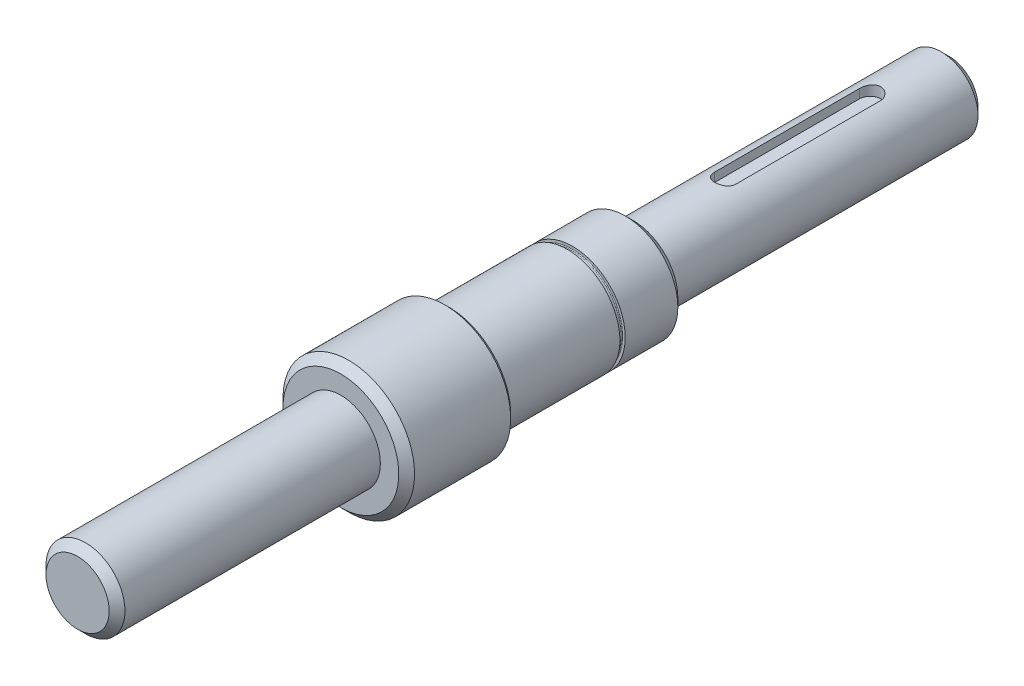
ISO-10303-21;
HEADER;
FILE_DESCRIPTION(('STEP AP214'),'2;1');
FILE_NAME('part.step','',(''),(''),'','','');
FILE_SCHEMA(('AUTOMOTIVE_DESIGN { 1 0 10303 214 1 1 1 1 }'));
ENDSEC;
DATA;
#1=APPLICATION_CONTEXT('core data for automotive mechanical design processes');
#2=APPLICATION_PROTOCOL_DEFINITION('international standard','automotive_design',2000,#1);
#3=PRODUCT_CONTEXT('',#1,'mechanical');
#4=PRODUCT('Part','Part','',(#3));
#5=PRODUCT_RELATED_PRODUCT_CATEGORY('part','',(#4));
#6=PRODUCT_DEFINITION_FORMATION('','',#4);
#7=PRODUCT_DEFINITION_CONTEXT('part definition',#1,'design');
#8=PRODUCT_DEFINITION('design','',#6,#7);
#9=PRODUCT_DEFINITION_SHAPE('','',#8);
#10=(LENGTH_UNIT() NAMED_UNIT(*) SI_UNIT(.MILLI.,.METRE.));
#11=(NAMED_UNIT(*) PLANE_ANGLE_UNIT() SI_UNIT($,.RADIAN.));
#12=(NAMED_UNIT(*) SI_UNIT($,.STERADIAN.) SOLID_ANGLE_UNIT());
#13=UNCERTAINTY_MEASURE_WITH_UNIT(LENGTH_MEASURE(1.E-05),#10,'distance_accuracy_value','');
#14=(GEOMETRIC_REPRESENTATION_CONTEXT(3) GLOBAL_UNCERTAINTY_ASSIGNED_CONTEXT((#13)) GLOBAL_UNIT_ASSIGNED_CONTEXT((#10,
#11,#12)) REPRESENTATION_CONTEXT('',''));
#15=CARTESIAN_POINT('',(0.,0.,0.));
#16=DIRECTION('',(0.,0.,1.));
#17=DIRECTION('',(1.,0.,0.));
#18=AXIS2_PLACEMENT_3D('',#15,#16,#17);
#19=CARTESIAN_POINT('',(0.,0.,0.));
#20=DIRECTION('',(0.,0.,1.));
#21=DIRECTION('',(1.,0.,0.));
#22=AXIS2_PLACEMENT_3D('',#19,#20,#21);
#23=CYLINDRICAL_SURFACE('',#22,20.);
#24=CARTESIAN_POINT('',(0.,0.,-186.));
#25=DIRECTION('',(0.,0.,-1.));
#26=DIRECTION('',(-1.,0.,0.));
#27=AXIS2_PLACEMENT_3D('',#24,#25,#26);
#28=CIRCLE('',#27,20.);
#29=CARTESIAN_POINT('',(-20.,0.,-186.));
#30=VERTEX_POINT('',#29);
#31=EDGE_CURVE('E124',#30,#30,#28,.T.);
#32=ORIENTED_EDGE('',*,*,#31,.F.);
#33=EDGE_LOOP('',(#32));
#34=FACE_BOUND('',#33,.T.);
#35=CARTESIAN_POINT('',(0.,0.,-141.));
#36=DIRECTION('',(0.,0.,-1.));
#37=DIRECTION('',(-1.,0.,0.));
#38=AXIS2_PLACEMENT_3D('',#35,#36,#37);
#39=CIRCLE('',#38,20.);
#40=CARTESIAN_POINT('',(-20.,0.,-141.));
#41=VERTEX_POINT('',#40);
#42=EDGE_CURVE('E111',#41,#41,#39,.T.);
#43=ORIENTED_EDGE('',*,*,#42,.T.);
#44=EDGE_LOOP('',(#43));
#45=FACE_BOUND('',#44,.T.);
#46=ADVANCED_FACE('F47',(#34,#45),#23,.T.);
#47=CARTESIAN_POINT('',(0.,0.,-186.));
#48=DIRECTION('',(0.,0.,-1.));
#49=DIRECTION('',(-1.,0.,0.));
#50=AXIS2_PLACEMENT_3D('',#47,#48,#49);
#51=PLANE('',#50);
#52=CARTESIAN_POINT('',(0.,0.,-186.));
#53=DIRECTION('',(0.,0.,-1.));
#54=DIRECTION('',(-1.,0.,0.));
#55=AXIS2_PLACEMENT_3D('',#52,#53,#54);
#56=CIRCLE('',#55,19.05);
#57=CARTESIAN_POINT('',(-19.05,0.,-186.));
#58=VERTEX_POINT('',#57);
#59=EDGE_CURVE('E167',#58,#58,#56,.F.);
#60=ORIENTED_EDGE('',*,*,#59,.T.);
#61=EDGE_LOOP('',(#60));
#62=FACE_BOUND('',#61,.T.);
#63=ORIENTED_EDGE('',*,*,#31,.T.);
#64=EDGE_LOOP('',(#63));
#65=FACE_BOUND('',#64,.T.);
#66=ADVANCED_FACE('F235',(#62,#65),#51,.T.);
#67=CARTESIAN_POINT('',(0.,0.,-188.));
#68=DIRECTION('',(0.,0.,-1.));
#69=DIRECTION('',(-1.,0.,0.));
#70=AXIS2_PLACEMENT_3D('',#67,#68,#69);
#71=PLANE('',#70);
#72=CARTESIAN_POINT('',(0.,0.,-188.));
#73=DIRECTION('',(0.,0.,-1.));
#74=DIRECTION('',(-1.,0.,0.));
#75=AXIS2_PLACEMENT_3D('',#72,#73,#74);
#76=CIRCLE('',#75,19.05);
#77=CARTESIAN_POINT('',(-19.05,0.,-188.));
#78=VERTEX_POINT('',#77);
#79=EDGE_CURVE('E166',#78,#78,#76,.T.);
#80=ORIENTED_EDGE('',*,*,#79,.T.);
#81=EDGE_LOOP('',(#80));
#82=FACE_BOUND('',#81,.T.);
#83=CARTESIAN_POINT('',(0.,0.,-188.));
#84=DIRECTION('',(0.,0.,-1.));
#85=DIRECTION('',(-1.,0.,0.));
#86=AXIS2_PLACEMENT_3D('',#83,#84,#85);
#87=CIRCLE('',#86,20.);
#88=CARTESIAN_POINT('',(-20.,0.,-188.));
#89=VERTEX_POINT('',#88);
#90=EDGE_CURVE('E121',#89,#89,#87,.T.);
#91=ORIENTED_EDGE('',*,*,#90,.F.);
#92=EDGE_LOOP('',(#91));
#93=FACE_BOUND('',#92,.T.);
#94=ADVANCED_FACE('F238',(#82,#93),#71,.F.);
#95=CARTESIAN_POINT('',(0.,0.,-186.));
#96=DIRECTION('',(0.,0.,-1.));
#97=DIRECTION('',(-1.,0.,0.));
#98=AXIS2_PLACEMENT_3D('',#95,#96,#97);
#99=CYLINDRICAL_SURFACE('',#98,18.75);
#100=CARTESIAN_POINT('',(0.,0.,-186.3));
#101=DIRECTION('',(0.,0.,-1.));
#102=DIRECTION('',(-1.,0.,0.));
#103=AXIS2_PLACEMENT_3D('',#100,#101,#102);
#104=CIRCLE('',#103,18.75);
#105=CARTESIAN_POINT('',(-18.75,0.,-186.3));
#106=VERTEX_POINT('',#105);
#107=EDGE_CURVE('E164',#106,#106,#104,.T.);
#108=ORIENTED_EDGE('',*,*,#107,.T.);
#109=EDGE_LOOP('',(#108));
#110=FACE_BOUND('',#109,.T.);
#111=CARTESIAN_POINT('',(0.,0.,-187.7));
#112=DIRECTION('',(0.,0.,-1.));
#113=DIRECTION('',(-1.,0.,0.));
#114=AXIS2_PLACEMENT_3D('',#111,#112,#113);
#115=CIRCLE('',#114,18.75);
#116=CARTESIAN_POINT('',(-18.75,0.,-187.7));
#117=VERTEX_POINT('',#116);
#118=EDGE_CURVE('E158',#117,#117,#115,.F.);
#119=ORIENTED_EDGE('',*,*,#118,.T.);
#120=EDGE_LOOP('',(#119));
#121=FACE_BOUND('',#120,.T.);
#122=ADVANCED_FACE('F205',(#110,#121),#99,.T.);
#123=CARTESIAN_POINT('',(0.,0.,-301.));
#124=DIRECTION('',(0.,0.,-1.));
#125=DIRECTION('',(-1.,0.,0.));
#126=AXIS2_PLACEMENT_3D('',#123,#124,#125);
#127=CONICAL_SURFACE('',#126,5.09999999999999,1.02974425867665);
#128=CARTESIAN_POINT('',(0.,0.,-297.935610842959));
#129=VERTEX_POINT('',#128);
#130=VERTEX_LOOP('',#129);
#131=FACE_BOUND('',#130,.T.);
#132=CARTESIAN_POINT('',(0.,0.,-301.));
#133=DIRECTION('',(0.,0.,-1.));
#134=DIRECTION('',(-1.,0.,0.));
#135=AXIS2_PLACEMENT_3D('',#132,#133,#134);
#136=CIRCLE('',#135,5.09999999999999);
#137=CARTESIAN_POINT('',(-5.09999999999999,0.,-301.));
#138=VERTEX_POINT('',#137);
#139=EDGE_CURVE('E134',#138,#138,#136,.T.);
#140=ORIENTED_EDGE('',*,*,#139,.T.);
#141=EDGE_LOOP('',(#140));
#142=FACE_BOUND('',#141,.T.);
#143=ADVANCED_FACE('F387',(#131,#142),#127,.F.);
#144=CARTESIAN_POINT('',(0.,0.,-331.));
#145=DIRECTION('',(0.,0.,-1.));
#146=DIRECTION('',(-1.,0.,0.));
#147=AXIS2_PLACEMENT_3D('',#144,#145,#146);
#148=CYLINDRICAL_SURFACE('',#147,5.09999999999999);
#149=ORIENTED_EDGE('',*,*,#139,.F.);
#150=EDGE_LOOP('',(#149));
#151=FACE_BOUND('',#150,.T.);
#152=CARTESIAN_POINT('',(0.,0.,-331.));
#153=DIRECTION('',(0.,0.,-1.));
#154=DIRECTION('',(-1.,0.,0.));
#155=AXIS2_PLACEMENT_3D('',#152,#153,#154);
#156=CIRCLE('',#155,5.1);
#157=CARTESIAN_POINT('',(-5.1,0.,-331.));
#158=VERTEX_POINT('',#157);
#159=EDGE_CURVE('E127',#158,#158,#156,.T.);
#160=ORIENTED_EDGE('',*,*,#159,.T.);
#161=EDGE_LOOP('',(#160));
#162=FACE_BOUND('',#161,.T.);
#163=ADVANCED_FACE('F386',(#151,#162),#148,.F.);
#164=CARTESIAN_POINT('',(0.,14.,-331.));
#165=DIRECTION('',(0.,0.,1.));
#166=DIRECTION('',(1.,0.,0.));
#167=AXIS2_PLACEMENT_3D('',#164,#165,#166);
#168=PLANE('',#167);
#169=ORIENTED_EDGE('',*,*,#159,.F.);
#170=EDGE_LOOP('',(#169));
#171=FACE_BOUND('',#170,.T.);
#172=CARTESIAN_POINT('',(0.,0.,-331.));
#173=DIRECTION('',(0.,0.,1.));
#174=DIRECTION('',(1.,0.,0.));
#175=AXIS2_PLACEMENT_3D('',#172,#173,#174);
#176=CIRCLE('',#175,11.0000000000001);
#177=CARTESIAN_POINT('',(11.0000000000001,0.,-331.));
#178=VERTEX_POINT('',#177);
#179=EDGE_CURVE('E160',#178,#178,#176,.F.);
#180=ORIENTED_EDGE('',*,*,#179,.T.);
#181=EDGE_LOOP('',(#180));
#182=FACE_BOUND('',#181,.T.);
#183=ADVANCED_FACE('F266',(#171,#182),#168,.F.);
#184=CARTESIAN_POINT('',(0.,0.,-328.));
#185=DIRECTION('',(0.,0.,1.));
#186=DIRECTION('',(1.,0.,0.));
#187=AXIS2_PLACEMENT_3D('',#184,#185,#186);
#188=CONICAL_SURFACE('',#187,14.,0.785398163397451);
#189=ORIENTED_EDGE('',*,*,#179,.F.);
#190=EDGE_LOOP('',(#189));
#191=FACE_BOUND('',#190,.T.);
#192=CARTESIAN_POINT('',(0.,0.,-328.));
#193=DIRECTION('',(0.,0.,1.));
#194=DIRECTION('',(1.,0.,0.));
#195=AXIS2_PLACEMENT_3D('',#192,#193,#194);
#196=CIRCLE('',#195,14.);
#197=CARTESIAN_POINT('',(14.,0.,-328.));
#198=VERTEX_POINT('',#197);
#199=EDGE_CURVE('E154',#198,#198,#196,.T.);
#200=ORIENTED_EDGE('',*,*,#199,.F.);
#201=EDGE_LOOP('',(#200));
#202=FACE_BOUND('',#201,.T.);
#203=ADVANCED_FACE('F257',(#191,#202),#188,.T.);
#204=CARTESIAN_POINT('',(0.,0.,0.));
#205=DIRECTION('',(0.,0.,1.));
#206=DIRECTION('',(1.,0.,0.));
#207=AXIS2_PLACEMENT_3D('',#204,#205,#206);
#208=CYLINDRICAL_SURFACE('',#207,14.);
#209=DIRECTION('',(0.,0.,1.));
#210=VECTOR('',#209,1.);
#211=CARTESIAN_POINT('',(-4.00000000000005,13.4164078649987,0.));
#212=LINE('',#211,#210);
#213=CARTESIAN_POINT('',(-4.00000000000001,13.4164078649987,-246.));
#214=VERTEX_POINT('',#213);
#215=CARTESIAN_POINT('',(-4.,13.4164078649987,-301.));
#216=VERTEX_POINT('',#215);
#217=EDGE_CURVE('E182',#214,#216,#212,.F.);
#218=ORIENTED_EDGE('',*,*,#217,.T.);
#219=CARTESIAN_POINT('',(-4.,13.4164078649987,-301.));
#220=CARTESIAN_POINT('',(-4.00001343424813,13.4163934343768,-301.110036938265));
#221=CARTESIAN_POINT('',(-3.99545969266926,13.417761265702,-301.220065459872));
#222=CARTESIAN_POINT('',(-3.97732232121695,13.4231542734801,-301.439287989373));
#223=CARTESIAN_POINT('',(-3.96374056379899,13.4271788988993,-301.548482165565));
#224=CARTESIAN_POINT('',(-3.92769415038321,13.4377658850065,-301.765008682583));
#225=CARTESIAN_POINT('',(-3.90525054417986,13.4443222312206,-301.872344810754));
#226=CARTESIAN_POINT('',(-3.85169716989989,13.4597622573638,-302.084633002554));
#227=CARTESIAN_POINT('',(-3.82058720849962,13.4686459892105,-302.189585012944));
#228=CARTESIAN_POINT('',(-3.71462722105447,13.4984072106126,-302.499717642999));
#229=CARTESIAN_POINT('',(-3.6271037719038,13.5224082651875,-302.700432400308));
#230=CARTESIAN_POINT('',(-3.42099335445292,13.5760110031023,-303.084316862067));
#231=CARTESIAN_POINT('',(-3.30239378136284,13.6056149576787,-303.267479405898));
#232=CARTESIAN_POINT('',(-3.03385514387189,13.6680345915526,-303.616369404888));
#233=CARTESIAN_POINT('',(-2.88318637668458,13.7009134336833,-303.78152502006));
#234=CARTESIAN_POINT('',(-2.55635049218509,13.7656378360174,-304.08460135598));
#235=CARTESIAN_POINT('',(-2.38017915468808,13.7974832241344,-304.222517560181));
#236=CARTESIAN_POINT('',(-2.00328797864422,13.8572672913436,-304.46965938831));
#237=CARTESIAN_POINT('',(-1.80217262010784,13.885122326296,-304.57830390558));
#238=CARTESIAN_POINT('',(-1.38360719231062,13.9330517158678,-304.760007003573));
#239=CARTESIAN_POINT('',(-1.1661610438381,13.9531279309862,-304.833074094601));
#240=CARTESIAN_POINT('',(-0.727119470413165,13.9827902284191,-304.939668316764));
#241=CARTESIAN_POINT('',(-0.505780313916704,13.9926363331616,-304.974177311461));
#242=CARTESIAN_POINT('',(-0.0602449633135534,14.0016419286283,-305.005773527505));
#243=CARTESIAN_POINT('',(0.163950738694262,14.0008032358133,-305.002867109631));
#244=CARTESIAN_POINT('',(0.601961495843499,13.9887201082301,-304.960387183875));
#245=CARTESIAN_POINT('',(0.815889248066107,13.9777773149303,-304.921876540054));
#246=CARTESIAN_POINT('',(1.23410663687488,13.9470775079522,-304.811008876966));
#247=CARTESIAN_POINT('',(1.43839578630405,13.9273200492871,-304.738650148951));
#248=CARTESIAN_POINT('',(1.8341490169319,13.8807804985664,-304.561381109693));
#249=CARTESIAN_POINT('',(2.02544821255194,13.8539238723959,-304.456123112832));
#250=CARTESIAN_POINT('',(2.38801825135017,13.7960546774321,-304.216306263055));
#251=CARTESIAN_POINT('',(2.55928501856377,13.7650412656095,-304.081741463019));
#252=CARTESIAN_POINT('',(2.88324485398745,13.7009177251593,-303.781613203087));
#253=CARTESIAN_POINT('',(3.03507809124178,13.6677722027509,-303.615129667492));
#254=CARTESIAN_POINT('',(3.30897556854654,13.6040627781022,-303.258573557128));
#255=CARTESIAN_POINT('',(3.43103136574908,13.573499609643,-303.068494315225));
#256=CARTESIAN_POINT('',(3.58945338157004,13.5321405016799,-302.768841328102));
#257=CARTESIAN_POINT('',(3.63832313759783,13.5190503394637,-302.666010156567));
#258=CARTESIAN_POINT('',(3.72718558970198,13.4948216745023,-302.456373741282));
#259=CARTESIAN_POINT('',(3.76718189032699,13.4836823796704,-302.349570131867));
#260=CARTESIAN_POINT('',(3.83791732102716,13.463719461374,-302.132861334789));
#261=CARTESIAN_POINT('',(3.86866612224973,13.4548934199316,-302.022959519801));
#262=CARTESIAN_POINT('',(3.92067829243348,13.4398293634308,-301.800804060039));
#263=CARTESIAN_POINT('',(3.9419460559715,13.4335901494402,-301.688551530165));
#264=CARTESIAN_POINT('',(3.97223001063663,13.4246640965205,-301.480267797862));
#265=CARTESIAN_POINT('',(3.98264484818433,13.4215735027143,-301.384454640876));
#266=CARTESIAN_POINT('',(3.99652828145244,13.4174428037393,-301.192430219405));
#267=CARTESIAN_POINT('',(4.00000747148811,13.4163995712304,-301.096219787408));
#268=CARTESIAN_POINT('',(4.,13.4164078649987,-301.));
#269=B_SPLINE_CURVE_WITH_KNOTS('',3,(#219,#220,#221,#222,#223,#224,#225,#226,#227,#228,#229,
#230,#231,#232,#233,#234,#235,#236,#237,#238,#239,#240,#241,#242,#243,#244,#245,#246,#247,#248,
#249,#250,#251,#252,#253,#254,#255,#256,#257,#258,#259,#260,#261,#262,#263,#264,#265,#266,#267,
#268),.UNSPECIFIED.,.F.,.F.,(4,2,2,2,2,2,2,2,2,2,2,2,2,2,2,2,2,2,2,2,2,2,2,2,4),(0.,
0.32999374304361,0.659919065086379,0.98906537585001,1.31821902959231,1.97575167696559,
2.6335514401874,3.30832474645295,3.98320984263715,4.67064278038706,5.35791119973412,
6.02724874934375,6.69647251025091,7.34634193868017,7.99624417788576,8.65326120487291,
9.31041168231768,9.99056134493204,10.6709036279931,11.0143588121195,11.357674222404,
11.700629330619,12.0434253092463,12.3324405185762,12.6210139131113),.UNSPECIFIED.);
#270=CARTESIAN_POINT('',(4.,13.4164078649987,-301.));
#271=VERTEX_POINT('',#270);
#272=EDGE_CURVE('E203',#216,#271,#269,.T.);
#273=ORIENTED_EDGE('',*,*,#272,.T.);
#274=DIRECTION('',(0.,0.,1.));
#275=VECTOR('',#274,1.);
#276=CARTESIAN_POINT('',(3.99999999999997,13.4164078649987,0.));
#277=LINE('',#276,#275);
#278=CARTESIAN_POINT('',(3.99999999999997,13.4164078649987,-246.));
#279=VERTEX_POINT('',#278);
#280=EDGE_CURVE('E91',#271,#279,#277,.T.);
#281=ORIENTED_EDGE('',*,*,#280,.T.);
#282=CARTESIAN_POINT('',(3.99999999999999,13.4164078649987,-246.));
#283=CARTESIAN_POINT('',(4.00001343424813,13.4163934343768,-245.889963061735));
#284=CARTESIAN_POINT('',(3.99545969266926,13.417761265702,-245.779934540128));
#285=CARTESIAN_POINT('',(3.97732232121694,13.4231542734801,-245.560712010627));
#286=CARTESIAN_POINT('',(3.96374056379898,13.4271788988993,-245.451517834435));
#287=CARTESIAN_POINT('',(3.9276941503832,13.4377658850065,-245.234991317418));
#288=CARTESIAN_POINT('',(3.90525054417985,13.4443222312206,-245.127655189246));
#289=CARTESIAN_POINT('',(3.85169716989988,13.4597622573638,-244.915366997446));
#290=CARTESIAN_POINT('',(3.82058720849961,13.4686459892105,-244.810414987056));
#291=CARTESIAN_POINT('',(3.71462722105447,13.4984072106126,-244.500282357001));
#292=CARTESIAN_POINT('',(3.62710377190382,13.5224082651875,-244.299567599693));
#293=CARTESIAN_POINT('',(3.42099335445293,13.5760110031023,-243.915683137933));
#294=CARTESIAN_POINT('',(3.30239378136283,13.6056149576788,-243.732520594102));
#295=CARTESIAN_POINT('',(3.03385514387187,13.6680345915527,-243.383630595112));
#296=CARTESIAN_POINT('',(2.88318637668458,13.7009134336833,-243.21847497994));
#297=CARTESIAN_POINT('',(2.55635049218508,13.7656378360174,-242.91539864402));
#298=CARTESIAN_POINT('',(2.38017915468807,13.7974832241344,-242.777482439819));
#299=CARTESIAN_POINT('',(2.00328797864421,13.8572672913436,-242.53034061169));
#300=CARTESIAN_POINT('',(1.80217262010786,13.885122326296,-242.42169609442));
#301=CARTESIAN_POINT('',(1.38360719231065,13.9330517158678,-242.239992996427));
#302=CARTESIAN_POINT('',(1.16616104383813,13.9531279309862,-242.166925905399));
#303=CARTESIAN_POINT('',(0.727119470413182,13.9827902284191,-242.060331683236));
#304=CARTESIAN_POINT('',(0.505780313916717,13.9926363331616,-242.025822688539));
#305=CARTESIAN_POINT('',(0.0602449633135534,14.0016419286283,-241.994226472495));
#306=CARTESIAN_POINT('',(-0.163950738694273,14.0008032358133,-241.997132890369));
#307=CARTESIAN_POINT('',(-0.601961495843524,13.9887201082301,-242.039612816125));
#308=CARTESIAN_POINT('',(-0.815889248066136,13.9777773149303,-242.078123459946));
#309=CARTESIAN_POINT('',(-1.2341066368749,13.9470775079522,-242.188991123034));
#310=CARTESIAN_POINT('',(-1.43839578630406,13.9273200492871,-242.261349851049));
#311=CARTESIAN_POINT('',(-1.8341490169319,13.8807804985664,-242.438618890307));
#312=CARTESIAN_POINT('',(-2.02544821255194,13.8539238723959,-242.543876887169));
#313=CARTESIAN_POINT('',(-2.38801825135016,13.7960546774321,-242.783693736945));
#314=CARTESIAN_POINT('',(-2.55928501856377,13.7650412656095,-242.918258536981));
#315=CARTESIAN_POINT('',(-2.88324485398744,13.7009177251593,-243.218386796913));
#316=CARTESIAN_POINT('',(-3.03507809124177,13.6677722027509,-243.384870332508));
#317=CARTESIAN_POINT('',(-3.30897556854653,13.6040627781022,-243.741426442872));
#318=CARTESIAN_POINT('',(-3.43103136574906,13.573499609643,-243.931505684775));
#319=CARTESIAN_POINT('',(-3.58945338157004,13.5321405016799,-244.231158671898));
#320=CARTESIAN_POINT('',(-3.63832313759783,13.5190503394637,-244.333989843433));
#321=CARTESIAN_POINT('',(-3.72718558970199,13.4948216745023,-244.543626258718));
#322=CARTESIAN_POINT('',(-3.767181890327,13.4836823796704,-244.650429868133));
#323=CARTESIAN_POINT('',(-3.83791732102718,13.463719461374,-244.867138665211));
#324=CARTESIAN_POINT('',(-3.86866612224974,13.4548934199316,-244.977040480199));
#325=CARTESIAN_POINT('',(-3.92067829243349,13.4398293634308,-245.199195939961));
#326=CARTESIAN_POINT('',(-3.94194605597151,13.4335901494402,-245.311448469835));
#327=CARTESIAN_POINT('',(-3.97223001063664,13.4246640965205,-245.519732202138));
#328=CARTESIAN_POINT('',(-3.98264484818435,13.4215735027143,-245.615545359124));
#329=CARTESIAN_POINT('',(-3.99652828145244,13.4174428037393,-245.807569780596));
#330=CARTESIAN_POINT('',(-4.00000747148811,13.4163995712304,-245.903780212592));
#331=CARTESIAN_POINT('',(-4.00000000000001,13.4164078649987,-246.));
#332=B_SPLINE_CURVE_WITH_KNOTS('',3,(#282,#283,#284,#285,#286,#287,#288,#289,#290,#291,#292,
#293,#294,#295,#296,#297,#298,#299,#300,#301,#302,#303,#304,#305,#306,#307,#308,#309,#310,#311,
#312,#313,#314,#315,#316,#317,#318,#319,#320,#321,#322,#323,#324,#325,#326,#327,#328,#329,#330,
#331),.UNSPECIFIED.,.F.,.F.,(4,2,2,2,2,2,2,2,2,2,2,2,2,2,2,2,2,2,2,2,2,2,2,2,4),(0.,
0.329993743043637,0.65991906508638,0.989065375850039,1.31821902959231,1.97575167696556,
2.63355144018741,3.30832474645297,3.98320984263714,4.67064278038705,5.35791119973408,
6.02724874934374,6.69647251025093,7.3463419386802,7.99624417788576,8.65326120487288,
9.31041168231765,9.99056134493198,10.6709036279931,11.0143588121194,11.357674222404,
11.700629330619,12.0434253092463,12.3324405185763,12.6210139131113),.UNSPECIFIED.);
#333=EDGE_CURVE('E174',#279,#214,#332,.T.);
#334=ORIENTED_EDGE('',*,*,#333,.T.);
#335=EDGE_LOOP('',(#218,#273,#281,#334));
#336=FACE_BOUND('',#335,.T.);
#337=ORIENTED_EDGE('',*,*,#199,.T.);
#338=EDGE_LOOP('',(#337));
#339=FACE_BOUND('',#338,.T.);
#340=CARTESIAN_POINT('',(0.,0.,-211.));
#341=DIRECTION('',(0.,0.,1.));
#342=DIRECTION('',(1.,0.,0.));
#343=AXIS2_PLACEMENT_3D('',#340,#341,#342);
#344=CIRCLE('',#343,14.);
#345=CARTESIAN_POINT('',(14.,0.,-211.));
#346=VERTEX_POINT('',#345);
#347=EDGE_CURVE('E137',#346,#346,#344,.T.);
#348=ORIENTED_EDGE('',*,*,#347,.F.);
#349=EDGE_LOOP('',(#348));
#350=FACE_BOUND('',#349,.T.);
#351=ADVANCED_FACE('F185',(#336,#339,#350),#208,.T.);
#352=CARTESIAN_POINT('',(0.,20.,-211.));
#353=DIRECTION('',(0.,0.,1.));
#354=DIRECTION('',(1.,0.,0.));
#355=AXIS2_PLACEMENT_3D('',#352,#353,#354);
#356=PLANE('',#355);
#357=CARTESIAN_POINT('',(0.,0.,-211.));
#358=DIRECTION('',(0.,0.,1.));
#359=DIRECTION('',(1.,0.,0.));
#360=AXIS2_PLACEMENT_3D('',#357,#358,#359);
#361=CIRCLE('',#360,17.0000000000001);
#362=CARTESIAN_POINT('',(17.0000000000001,0.,-211.));
#363=VERTEX_POINT('',#362);
#364=EDGE_CURVE('E11',#363,#363,#361,.F.);
#365=ORIENTED_EDGE('',*,*,#364,.T.);
#366=EDGE_LOOP('',(#365));
#367=FACE_BOUND('',#366,.T.);
#368=ORIENTED_EDGE('',*,*,#347,.T.);
#369=EDGE_LOOP('',(#368));
#370=FACE_BOUND('',#369,.T.);
#371=ADVANCED_FACE('F247',(#367,#370),#356,.F.);
#372=CARTESIAN_POINT('',(0.,0.,-208.));
#373=DIRECTION('',(0.,0.,1.));
#374=DIRECTION('',(1.,0.,0.));
#375=AXIS2_PLACEMENT_3D('',#372,#373,#374);
#376=CIRCLE('',#375,20.);
#377=CARTESIAN_POINT('',(20.,0.,-208.));
#378=VERTEX_POINT('',#377);
#379=EDGE_CURVE('E59',#378,#378,#376,.T.);
#380=ORIENTED_EDGE('',*,*,#379,.T.);
#381=EDGE_LOOP('',(#380));
#382=FACE_BOUND('',#381,.T.);
#383=ORIENTED_EDGE('',*,*,#90,.T.);
#384=EDGE_LOOP('',(#383));
#385=FACE_BOUND('',#384,.T.);
#386=ADVANCED_FACE('F219',(#382,#385),#23,.T.);
#387=CARTESIAN_POINT('',(0.,0.,-186.3));
#388=DIRECTION('',(0.,0.,-1.));
#389=DIRECTION('',(-1.,0.,0.));
#390=AXIS2_PLACEMENT_3D('',#387,#388,#389);
#391=TOROIDAL_SURFACE('',#390,19.05,0.3);
#392=ORIENTED_EDGE('',*,*,#59,.F.);
#393=EDGE_LOOP('',(#392));
#394=FACE_BOUND('',#393,.T.);
#395=ORIENTED_EDGE('',*,*,#107,.F.);
#396=EDGE_LOOP('',(#395));
#397=FACE_BOUND('',#396,.T.);
#398=ADVANCED_FACE('F243',(#394,#397),#391,.F.);
#399=CARTESIAN_POINT('',(0.,0.,-187.7));
#400=DIRECTION('',(0.,0.,-1.));
#401=DIRECTION('',(-1.,0.,0.));
#402=AXIS2_PLACEMENT_3D('',#399,#400,#401);
#403=TOROIDAL_SURFACE('',#402,19.05,0.3);
#404=ORIENTED_EDGE('',*,*,#118,.F.);
#405=EDGE_LOOP('',(#404));
#406=FACE_BOUND('',#405,.T.);
#407=ORIENTED_EDGE('',*,*,#79,.F.);
#408=EDGE_LOOP('',(#407));
#409=FACE_BOUND('',#408,.T.);
#410=ADVANCED_FACE('F201',(#406,#409),#403,.F.);
#411=CARTESIAN_POINT('',(0.,25.,-301.));
#412=DIRECTION('',(0.,-1.,0.));
#413=DIRECTION('',(0.,0.,-1.));
#414=AXIS2_PLACEMENT_3D('',#411,#412,#413);
#415=CYLINDRICAL_SURFACE('',#414,4.);
#416=DIRECTION('',(0.,-1.,0.));
#417=VECTOR('',#416,1.);
#418=CARTESIAN_POINT('',(-4.,25.,-301.));
#419=LINE('',#418,#417);
#420=CARTESIAN_POINT('',(-4.,10.,-301.));
#421=VERTEX_POINT('',#420);
#422=EDGE_CURVE('E115',#216,#421,#419,.T.);
#423=ORIENTED_EDGE('',*,*,#422,.T.);
#424=CARTESIAN_POINT('',(0.,10.,-301.));
#425=DIRECTION('',(0.,-1.,0.));
#426=DIRECTION('',(0.,0.,-1.));
#427=AXIS2_PLACEMENT_3D('',#424,#425,#426);
#428=CIRCLE('',#427,4.);
#429=CARTESIAN_POINT('',(4.,10.,-301.));
#430=VERTEX_POINT('',#429);
#431=EDGE_CURVE('E102',#421,#430,#428,.T.);
#432=ORIENTED_EDGE('',*,*,#431,.T.);
#433=DIRECTION('',(0.,-1.,0.));
#434=VECTOR('',#433,1.);
#435=CARTESIAN_POINT('',(4.,25.,-301.));
#436=LINE('',#435,#434);
#437=EDGE_CURVE('E86',#271,#430,#436,.T.);
#438=ORIENTED_EDGE('',*,*,#437,.F.);
#439=ORIENTED_EDGE('',*,*,#272,.F.);
#440=EDGE_LOOP('',(#423,#432,#438,#439));
#441=FACE_BOUND('',#440,.T.);
#442=ADVANCED_FACE('F109',(#441),#415,.F.);
#443=CARTESIAN_POINT('',(-4.,25.,-301.));
#444=DIRECTION('',(-1.,0.,0.));
#445=DIRECTION('',(0.,0.,1.));
#446=AXIS2_PLACEMENT_3D('',#443,#444,#445);
#447=PLANE('',#446);
#448=DIRECTION('',(0.,-1.,0.));
#449=VECTOR('',#448,1.);
#450=CARTESIAN_POINT('',(-4.00000000000001,25.,-246.));
#451=LINE('',#450,#449);
#452=CARTESIAN_POINT('',(-4.00000000000001,10.,-246.));
#453=VERTEX_POINT('',#452);
#454=EDGE_CURVE('E125',#214,#453,#451,.T.);
#455=ORIENTED_EDGE('',*,*,#454,.T.);
#456=DIRECTION('',(0.,0.,-1.));
#457=VECTOR('',#456,1.);
#458=CARTESIAN_POINT('',(-4.,10.,-301.));
#459=LINE('',#458,#457);
#460=EDGE_CURVE('E99',#453,#421,#459,.T.);
#461=ORIENTED_EDGE('',*,*,#460,.T.);
#462=ORIENTED_EDGE('',*,*,#422,.F.);
#463=ORIENTED_EDGE('',*,*,#217,.F.);
#464=EDGE_LOOP('',(#455,#461,#462,#463));
#465=FACE_BOUND('',#464,.T.);
#466=ADVANCED_FACE('F193',(#465),#447,.F.);
#467=CARTESIAN_POINT('',(0.,25.,-246.));
#468=DIRECTION('',(0.,-1.,0.));
#469=DIRECTION('',(0.,0.,-1.));
#470=AXIS2_PLACEMENT_3D('',#467,#468,#469);
#471=CYLINDRICAL_SURFACE('',#470,4.);
#472=DIRECTION('',(0.,-1.,0.));
#473=VECTOR('',#472,1.);
#474=CARTESIAN_POINT('',(4.,25.,-246.));
#475=LINE('',#474,#473);
#476=CARTESIAN_POINT('',(4.,10.,-246.));
#477=VERTEX_POINT('',#476);
#478=EDGE_CURVE('E63',#279,#477,#475,.T.);
#479=ORIENTED_EDGE('',*,*,#478,.T.);
#480=CARTESIAN_POINT('',(0.,10.,-246.));
#481=DIRECTION('',(0.,-1.,0.));
#482=DIRECTION('',(0.,0.,-1.));
#483=AXIS2_PLACEMENT_3D('',#480,#481,#482);
#484=CIRCLE('',#483,4.);
#485=EDGE_CURVE('E106',#477,#453,#484,.T.);
#486=ORIENTED_EDGE('',*,*,#485,.T.);
#487=ORIENTED_EDGE('',*,*,#454,.F.);
#488=ORIENTED_EDGE('',*,*,#333,.F.);
#489=EDGE_LOOP('',(#479,#486,#487,#488));
#490=FACE_BOUND('',#489,.T.);
#491=ADVANCED_FACE('F186',(#490),#471,.F.);
#492=CARTESIAN_POINT('',(4.,25.,-301.));
#493=DIRECTION('',(1.,0.,0.));
#494=DIRECTION('',(0.,0.,-1.));
#495=AXIS2_PLACEMENT_3D('',#492,#493,#494);
#496=PLANE('',#495);
#497=ORIENTED_EDGE('',*,*,#437,.T.);
#498=DIRECTION('',(0.,0.,1.));
#499=VECTOR('',#498,1.);
#500=CARTESIAN_POINT('',(4.,10.,-301.));
#501=LINE('',#500,#499);
#502=EDGE_CURVE('E95',#430,#477,#501,.T.);
#503=ORIENTED_EDGE('',*,*,#502,.T.);
#504=ORIENTED_EDGE('',*,*,#478,.F.);
#505=ORIENTED_EDGE('',*,*,#280,.F.);
#506=EDGE_LOOP('',(#497,#503,#504,#505));
#507=FACE_BOUND('',#506,.T.);
#508=ADVANCED_FACE('F92',(#507),#496,.F.);
#509=CARTESIAN_POINT('',(0.,10.,-301.));
#510=DIRECTION('',(0.,-1.,0.));
#511=DIRECTION('',(0.,0.,-1.));
#512=AXIS2_PLACEMENT_3D('',#509,#510,#511);
#513=PLANE('',#512);
#514=ORIENTED_EDGE('',*,*,#431,.F.);
#515=ORIENTED_EDGE('',*,*,#460,.F.);
#516=ORIENTED_EDGE('',*,*,#485,.F.);
#517=ORIENTED_EDGE('',*,*,#502,.F.);
#518=EDGE_LOOP('',(#514,#515,#516,#517));
#519=FACE_BOUND('',#518,.T.);
#520=ADVANCED_FACE('F101',(#519),#513,.F.);
#521=CARTESIAN_POINT('',(0.,0.,-141.));
#522=DIRECTION('',(0.,0.,-1.));
#523=DIRECTION('',(-1.,0.,0.));
#524=AXIS2_PLACEMENT_3D('',#521,#522,#523);
#525=PLANE('',#524);
#526=CARTESIAN_POINT('',(0.,0.,-141.));
#527=DIRECTION('',(0.,0.,-1.));
#528=DIRECTION('',(-1.,0.,0.));
#529=AXIS2_PLACEMENT_3D('',#526,#527,#528);
#530=CIRCLE('',#529,23.5);
#531=CARTESIAN_POINT('',(-23.5,0.,-141.));
#532=VERTEX_POINT('',#531);
#533=EDGE_CURVE('E208',#532,#532,#530,.T.);
#534=ORIENTED_EDGE('',*,*,#533,.T.);
#535=EDGE_LOOP('',(#534));
#536=FACE_BOUND('',#535,.T.);
#537=ORIENTED_EDGE('',*,*,#42,.F.);
#538=EDGE_LOOP('',(#537));
#539=FACE_BOUND('',#538,.T.);
#540=ADVANCED_FACE('F293',(#536,#539),#525,.T.);
#541=CARTESIAN_POINT('',(0.,0.,0.));
#542=DIRECTION('',(0.,0.,-1.));
#543=DIRECTION('',(-1.,0.,0.));
#544=AXIS2_PLACEMENT_3D('',#541,#542,#543);
#545=PLANE('',#544);
#546=CARTESIAN_POINT('',(0.,0.,0.));
#547=DIRECTION('',(0.,0.,-1.));
#548=DIRECTION('',(-1.,0.,0.));
#549=AXIS2_PLACEMENT_3D('',#546,#547,#548);
#550=CIRCLE('',#549,12.);
#551=CARTESIAN_POINT('',(-12.,0.,0.));
#552=VERTEX_POINT('',#551);
#553=EDGE_CURVE('E149',#552,#552,#550,.F.);
#554=ORIENTED_EDGE('',*,*,#553,.T.);
#555=EDGE_LOOP('',(#554));
#556=FACE_BOUND('',#555,.T.);
#557=ADVANCED_FACE('F322',(#556),#545,.F.);
#558=CARTESIAN_POINT('',(0.,0.,0.));
#559=DIRECTION('',(0.,0.,-1.));
#560=DIRECTION('',(-1.,0.,0.));
#561=AXIS2_PLACEMENT_3D('',#558,#559,#560);
#562=CONICAL_SURFACE('',#561,12.,0.785398163397449);
#563=CARTESIAN_POINT('',(0.,0.,-3.00000000000001));
#564=DIRECTION('',(0.,0.,-1.));
#565=DIRECTION('',(-1.,0.,0.));
#566=AXIS2_PLACEMENT_3D('',#563,#564,#565);
#567=CIRCLE('',#566,15.);
#568=CARTESIAN_POINT('',(-15.,0.,-3.00000000000001));
#569=VERTEX_POINT('',#568);
#570=EDGE_CURVE('E153',#569,#569,#567,.T.);
#571=ORIENTED_EDGE('',*,*,#570,.F.);
#572=EDGE_LOOP('',(#571));
#573=FACE_BOUND('',#572,.T.);
#574=ORIENTED_EDGE('',*,*,#553,.F.);
#575=EDGE_LOOP('',(#574));
#576=FACE_BOUND('',#575,.T.);
#577=ADVANCED_FACE('F340',(#573,#576),#562,.T.);
#578=CARTESIAN_POINT('',(0.,0.,0.));
#579=DIRECTION('',(0.,0.,1.));
#580=DIRECTION('',(1.,0.,0.));
#581=AXIS2_PLACEMENT_3D('',#578,#579,#580);
#582=CYLINDRICAL_SURFACE('',#581,15.);
#583=ORIENTED_EDGE('',*,*,#570,.T.);
#584=EDGE_LOOP('',(#583));
#585=FACE_BOUND('',#584,.T.);
#586=CARTESIAN_POINT('',(0.,0.,-100.));
#587=DIRECTION('',(0.,0.,1.));
#588=DIRECTION('',(1.,0.,0.));
#589=AXIS2_PLACEMENT_3D('',#586,#587,#588);
#590=CIRCLE('',#589,15.);
#591=CARTESIAN_POINT('',(15.,0.,-100.));
#592=VERTEX_POINT('',#591);
#593=EDGE_CURVE('E136',#592,#592,#590,.T.);
#594=ORIENTED_EDGE('',*,*,#593,.T.);
#595=EDGE_LOOP('',(#594));
#596=FACE_BOUND('',#595,.T.);
#597=ADVANCED_FACE('F348',(#585,#596),#582,.T.);
#598=CARTESIAN_POINT('',(0.,15.,-100.));
#599=DIRECTION('',(0.,0.,-1.));
#600=DIRECTION('',(-1.,0.,0.));
#601=AXIS2_PLACEMENT_3D('',#598,#599,#600);
#602=PLANE('',#601);
#603=CARTESIAN_POINT('',(0.,0.,-100.));
#604=DIRECTION('',(0.,0.,-1.));
#605=DIRECTION('',(-1.,0.,0.));
#606=AXIS2_PLACEMENT_3D('',#603,#604,#605);
#607=CIRCLE('',#606,22.);
#608=CARTESIAN_POINT('',(-22.,0.,-100.));
#609=VERTEX_POINT('',#608);
#610=EDGE_CURVE('E145',#609,#609,#607,.F.);
#611=ORIENTED_EDGE('',*,*,#610,.T.);
#612=EDGE_LOOP('',(#611));
#613=FACE_BOUND('',#612,.T.);
#614=ORIENTED_EDGE('',*,*,#593,.F.);
#615=EDGE_LOOP('',(#614));
#616=FACE_BOUND('',#615,.T.);
#617=ADVANCED_FACE('F356',(#613,#616),#602,.F.);
#618=CARTESIAN_POINT('',(0.,0.,-100.));
#619=DIRECTION('',(0.,0.,-1.));
#620=DIRECTION('',(-1.,0.,0.));
#621=AXIS2_PLACEMENT_3D('',#618,#619,#620);
#622=CONICAL_SURFACE('',#621,22.,0.785398163397443);
#623=CARTESIAN_POINT('',(0.,0.,-103.));
#624=DIRECTION('',(0.,0.,-1.));
#625=DIRECTION('',(-1.,0.,0.));
#626=AXIS2_PLACEMENT_3D('',#623,#624,#625);
#627=CIRCLE('',#626,25.);
#628=CARTESIAN_POINT('',(-25.,0.,-103.));
#629=VERTEX_POINT('',#628);
#630=EDGE_CURVE('E143',#629,#629,#627,.T.);
#631=ORIENTED_EDGE('',*,*,#630,.F.);
#632=EDGE_LOOP('',(#631));
#633=FACE_BOUND('',#632,.T.);
#634=ORIENTED_EDGE('',*,*,#610,.F.);
#635=EDGE_LOOP('',(#634));
#636=FACE_BOUND('',#635,.T.);
#637=ADVANCED_FACE('F302',(#633,#636),#622,.T.);
#638=CARTESIAN_POINT('',(0.,0.,0.));
#639=DIRECTION('',(0.,0.,1.));
#640=DIRECTION('',(1.,0.,0.));
#641=AXIS2_PLACEMENT_3D('',#638,#639,#640);
#642=CYLINDRICAL_SURFACE('',#641,25.);
#643=CARTESIAN_POINT('',(0.,0.,-139.5));
#644=DIRECTION('',(0.,0.,-1.));
#645=DIRECTION('',(-1.,0.,0.));
#646=AXIS2_PLACEMENT_3D('',#643,#644,#645);
#647=CIRCLE('',#646,25.);
#648=CARTESIAN_POINT('',(-25.,0.,-139.5));
#649=VERTEX_POINT('',#648);
#650=EDGE_CURVE('E214',#649,#649,#647,.F.);
#651=ORIENTED_EDGE('',*,*,#650,.T.);
#652=EDGE_LOOP('',(#651));
#653=FACE_BOUND('',#652,.T.);
#654=ORIENTED_EDGE('',*,*,#630,.T.);
#655=EDGE_LOOP('',(#654));
#656=FACE_BOUND('',#655,.T.);
#657=ADVANCED_FACE('F226',(#653,#656),#642,.T.);
#658=CARTESIAN_POINT('',(0.,0.,-141.));
#659=DIRECTION('',(0.,0.,1.));
#660=DIRECTION('',(1.,0.,0.));
#661=AXIS2_PLACEMENT_3D('',#658,#659,#660);
#662=CONICAL_SURFACE('',#661,23.5,0.785398163397431);
#663=ORIENTED_EDGE('',*,*,#650,.F.);
#664=EDGE_LOOP('',(#663));
#665=FACE_BOUND('',#664,.T.);
#666=ORIENTED_EDGE('',*,*,#533,.F.);
#667=EDGE_LOOP('',(#666));
#668=FACE_BOUND('',#667,.T.);
#669=ADVANCED_FACE('F225',(#665,#668),#662,.T.);
#670=CARTESIAN_POINT('',(0.,0.,-208.));
#671=DIRECTION('',(0.,0.,1.));
#672=DIRECTION('',(1.,0.,0.));
#673=AXIS2_PLACEMENT_3D('',#670,#671,#672);
#674=CONICAL_SURFACE('',#673,20.,0.785398163397446);
#675=ORIENTED_EDGE('',*,*,#364,.F.);
#676=EDGE_LOOP('',(#675));
#677=FACE_BOUND('',#676,.T.);
#678=ORIENTED_EDGE('',*,*,#379,.F.);
#679=EDGE_LOOP('',(#678));
#680=FACE_BOUND('',#679,.T.);
#681=ADVANCED_FACE('F55',(#677,#680),#674,.T.);
#682=CLOSED_SHELL('',(#46,#66,#94,#122,#143,#163,#183,#203,#351,#371,#386,#398,#410,#442,#466,
#491,#508,#520,#540,#557,#577,#597,#617,#637,#657,#669,#681));
#683=MANIFOLD_SOLID_BREP('B2',#682);
#684=ADVANCED_BREP_SHAPE_REPRESENTATION('',(#18,#683),#14);
#685=SHAPE_DEFINITION_REPRESENTATION(#9,#684);
ENDSEC;
END-ISO-10303-21;
